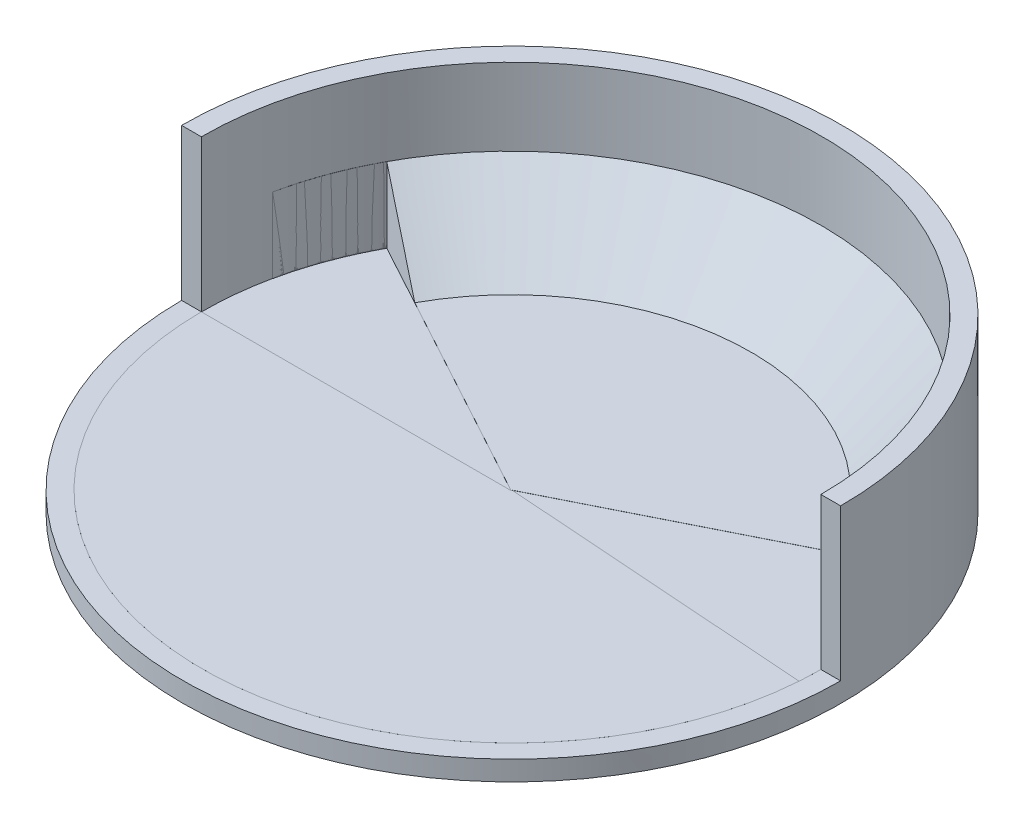
ISO-10303-21;
HEADER;
FILE_DESCRIPTION(('STEP AP214'),'2;1');
FILE_NAME('part.step','',(''),(''),'','','');
FILE_SCHEMA(('AUTOMOTIVE_DESIGN { 1 0 10303 214 1 1 1 1 }'));
ENDSEC;
DATA;
#1=APPLICATION_CONTEXT('core data for automotive mechanical design processes');
#2=APPLICATION_PROTOCOL_DEFINITION('international standard','automotive_design',2000,#1);
#3=PRODUCT_CONTEXT('',#1,'mechanical');
#4=PRODUCT('Part','Part','',(#3));
#5=PRODUCT_RELATED_PRODUCT_CATEGORY('part','',(#4));
#6=PRODUCT_DEFINITION_FORMATION('','',#4);
#7=PRODUCT_DEFINITION_CONTEXT('part definition',#1,'design');
#8=PRODUCT_DEFINITION('design','',#6,#7);
#9=PRODUCT_DEFINITION_SHAPE('','',#8);
#10=(LENGTH_UNIT() NAMED_UNIT(*) SI_UNIT(.MILLI.,.METRE.));
#11=(NAMED_UNIT(*) PLANE_ANGLE_UNIT() SI_UNIT($,.RADIAN.));
#12=(NAMED_UNIT(*) SI_UNIT($,.STERADIAN.) SOLID_ANGLE_UNIT());
#13=UNCERTAINTY_MEASURE_WITH_UNIT(LENGTH_MEASURE(1.E-05),#10,'distance_accuracy_value','');
#14=(GEOMETRIC_REPRESENTATION_CONTEXT(3) GLOBAL_UNCERTAINTY_ASSIGNED_CONTEXT((#13)) GLOBAL_UNIT_ASSIGNED_CONTEXT((#10,
#11,#12)) REPRESENTATION_CONTEXT('',''));
#15=CARTESIAN_POINT('',(0.,0.,0.));
#16=DIRECTION('',(0.,0.,1.));
#17=DIRECTION('',(1.,0.,0.));
#18=AXIS2_PLACEMENT_3D('',#15,#16,#17);
#19=CARTESIAN_POINT('',(-23.4999038261825,1.5,0.0712084203185763));
#20=DIRECTION('',(0.,1.,0.));
#21=DIRECTION('',(-1.,0.,0.));
#22=AXIS2_PLACEMENT_3D('',#19,#20,#21);
#23=PLANE('',#22);
#24=DIRECTION('',(0.878753559484383,0.,0.477275792067362));
#25=VECTOR('',#24,1.);
#26=CARTESIAN_POINT('',(-18.1450892599968,1.5,-9.78800178607371));
#27=LINE('',#26,#25);
#28=CARTESIAN_POINT('',(-20.6506141570449,1.50000000000001,-11.148822879629));
#29=VERTEX_POINT('',#28);
#30=CARTESIAN_POINT('',(-15.9988902095269,1.5,-8.62234067359039));
#31=VERTEX_POINT('',#30);
#32=EDGE_CURVE('E98',#29,#31,#27,.T.);
#33=ORIENTED_EDGE('',*,*,#32,.F.);
#34=CARTESIAN_POINT('',(0.,1.5,0.0671069133202412));
#35=DIRECTION('',(0.,1.,0.));
#36=DIRECTION('',(-1.,0.,0.));
#37=AXIS2_PLACEMENT_3D('',#34,#35,#36);
#38=CIRCLE('',#37,23.4998924717436);
#39=CARTESIAN_POINT('',(-22.9848333838979,1.50000000000001,-4.8259882725473));
#40=VERTEX_POINT('',#39);
#41=EDGE_CURVE('E103',#40,#29,#38,.F.);
#42=ORIENTED_EDGE('',*,*,#41,.F.);
#43=DIRECTION('',(0.978082491719274,0.,0.208217769155797));
#44=VECTOR('',#43,1.);
#45=CARTESIAN_POINT('',(-22.4802386811067,1.5,-4.71856831131445));
#46=LINE('',#45,#44);
#47=CARTESIAN_POINT('',(-22.9848448395551,1.5,-4.82599071126938));
#48=VERTEX_POINT('',#47);
#49=EDGE_CURVE('E123',#48,#40,#46,.T.);
#50=ORIENTED_EDGE('',*,*,#49,.F.);
#51=CARTESIAN_POINT('',(0.,1.5,0.0671069133202412));
#52=DIRECTION('',(0.,-1.,0.));
#53=DIRECTION('',(1.,0.,0.));
#54=AXIS2_PLACEMENT_3D('',#51,#52,#53);
#55=CIRCLE('',#54,23.4999041841065);
#56=CARTESIAN_POINT('',(20.9917102742925,1.5,-10.4966801170182));
#57=VERTEX_POINT('',#56);
#58=EDGE_CURVE('E112',#48,#57,#55,.T.);
#59=ORIENTED_EDGE('',*,*,#58,.T.);
#60=DIRECTION('',(-0.894413130287023,0.,0.447241715820616));
#61=VECTOR('',#60,1.);
#62=CARTESIAN_POINT('',(-18.8278166940009,1.5,9.41464828527145));
#63=LINE('',#62,#61);
#64=CARTESIAN_POINT('',(16.2570612315681,1.5,-8.12916952267244));
#65=VERTEX_POINT('',#64);
#66=EDGE_CURVE('E117',#57,#65,#63,.T.);
#67=ORIENTED_EDGE('',*,*,#66,.T.);
#68=CARTESIAN_POINT('',(0.,1.5,0.0671069133202412));
#69=DIRECTION('',(0.,-1.,0.));
#70=DIRECTION('',(1.,0.,0.));
#71=AXIS2_PLACEMENT_3D('',#68,#69,#70);
#72=CIRCLE('',#71,18.2063446990922);
#73=EDGE_CURVE('E116',#31,#65,#72,.T.);
#74=ORIENTED_EDGE('',*,*,#73,.F.);
#75=EDGE_LOOP('',(#33,#42,#50,#59,#67,#74));
#76=FACE_BOUND('',#75,.T.);
#77=ADVANCED_FACE('F46',(#76),#23,.F.);
#78=CARTESIAN_POINT('',(0.,7.18907418889528,0.0671069133202412));
#79=DIRECTION('',(0.,1.,0.));
#80=DIRECTION('',(-1.,0.,0.));
#81=AXIS2_PLACEMENT_3D('',#78,#79,#80);
#82=CONICAL_SURFACE('',#81,23.4999041841065,0.749400982278209);
#83=CARTESIAN_POINT('',(0.,7.189061601429,0.0671069133202412));
#84=DIRECTION('',(0.,1.,0.));
#85=DIRECTION('',(-1.,0.,0.));
#86=AXIS2_PLACEMENT_3D('',#83,#84,#85);
#87=CIRCLE('',#86,23.4998924717436);
#88=CARTESIAN_POINT('',(-22.984833383898,7.18906160142902,-4.82598827254731));
#89=VERTEX_POINT('',#88);
#90=CARTESIAN_POINT('',(-20.6506141570449,7.18906160142901,-11.148822879629));
#91=VERTEX_POINT('',#90);
#92=EDGE_CURVE('E62',#89,#91,#87,.F.);
#93=ORIENTED_EDGE('',*,*,#92,.T.);
#94=DIRECTION('',(0.598607226270921,-0.732097051273404,0.325120433336666));
#95=VECTOR('',#94,1.);
#96=CARTESIAN_POINT('',(0.,-18.0666537789848,0.0671069133202412));
#97=LINE('',#96,#95);
#98=EDGE_CURVE('E12',#91,#31,#97,.T.);
#99=ORIENTED_EDGE('',*,*,#98,.T.);
#100=ORIENTED_EDGE('',*,*,#73,.T.);
#101=CARTESIAN_POINT('',(20.9918767212185,7.18927418889528,-10.4967633470227));
#102=CARTESIAN_POINT('',(20.2027135171331,6.24102802044445,-10.1021507306533));
#103=CARTESIAN_POINT('',(19.4135500870123,5.29278208714443,-9.70753800125739));
#104=CARTESIAN_POINT('',(17.8352227746996,3.396290690846,-8.91831231641224));
#105=CARTESIAN_POINT('',(17.0460588925078,2.44804522784759,-8.52369936096304));
#106=CARTESIAN_POINT('',(16.2568947842805,1.4998,-8.12908629248722));
#107=B_SPLINE_CURVE_WITH_KNOTS('',3,(#101,#102,#103,#104,#105,#106),.UNSPECIFIED.,.F.,.F.,(4,2,
4),(0.,3.88574526712097,7.771490534242),.UNSPECIFIED.);
#108=CARTESIAN_POINT('',(20.9917102742925,7.18907418889528,-10.4966801170182));
#109=VERTEX_POINT('',#108);
#110=EDGE_CURVE('E114',#109,#65,#107,.T.);
#111=ORIENTED_EDGE('',*,*,#110,.F.);
#112=CARTESIAN_POINT('',(0.,7.18907418889528,0.0671069133202412));
#113=DIRECTION('',(0.,-1.,0.));
#114=DIRECTION('',(1.,0.,0.));
#115=AXIS2_PLACEMENT_3D('',#112,#113,#114);
#116=CIRCLE('',#115,23.4999041841065);
#117=CARTESIAN_POINT('',(-22.984844839555,7.18907418889527,-4.82599071126938));
#118=VERTEX_POINT('',#117);
#119=EDGE_CURVE('E121',#118,#109,#116,.T.);
#120=ORIENTED_EDGE('',*,*,#119,.F.);
#121=DIRECTION('',(0.666270128994717,-0.732097051273404,0.141838015800248));
#122=VECTOR('',#121,1.);
#123=CARTESIAN_POINT('',(0.,-18.0666537789848,0.0671069133202412));
#124=LINE('',#123,#122);
#125=EDGE_CURVE('E107',#118,#89,#124,.T.);
#126=ORIENTED_EDGE('',*,*,#125,.T.);
#127=EDGE_LOOP('',(#93,#99,#100,#111,#120,#126));
#128=FACE_BOUND('',#127,.T.);
#129=ADVANCED_FACE('F48',(#128),#82,.F.);
#130=CARTESIAN_POINT('',(-0.0136666016917367,32.51,0.0641975172925174));
#131=DIRECTION('',(-0.208217769155797,0.,0.978082491719274));
#132=DIRECTION('',(0.978082491719274,0.,0.208217769155797));
#133=AXIS2_PLACEMENT_3D('',#130,#131,#132);
#134=PLANE('',#133);
#135=ORIENTED_EDGE('',*,*,#49,.T.);
#136=DIRECTION('',(0.,-1.,0.));
#137=VECTOR('',#136,1.);
#138=CARTESIAN_POINT('',(-22.9848333838979,27.51,-4.8259882725473));
#139=LINE('',#138,#137);
#140=EDGE_CURVE('E55',#40,#89,#139,.F.);
#141=ORIENTED_EDGE('',*,*,#140,.T.);
#142=ORIENTED_EDGE('',*,*,#125,.F.);
#143=DIRECTION('',(0.,-1.,0.));
#144=VECTOR('',#143,1.);
#145=CARTESIAN_POINT('',(-22.9848448395551,0.,-4.82599071126938));
#146=LINE('',#145,#144);
#147=EDGE_CURVE('E118',#48,#118,#146,.F.);
#148=ORIENTED_EDGE('',*,*,#147,.F.);
#149=EDGE_LOOP('',(#135,#141,#142,#148));
#150=FACE_BOUND('',#149,.T.);
#151=ADVANCED_FACE('F138',(#150),#134,.T.);
#152=CARTESIAN_POINT('',(0.,0.,0.0671069133202412));
#153=DIRECTION('',(0.,-1.,0.));
#154=DIRECTION('',(1.,0.,0.));
#155=AXIS2_PLACEMENT_3D('',#152,#153,#154);
#156=CYLINDRICAL_SURFACE('',#155,23.4999041841065);
#157=DIRECTION('',(0.,-1.,0.));
#158=VECTOR('',#157,1.);
#159=CARTESIAN_POINT('',(20.9917102742925,0.,-10.4966801170182));
#160=LINE('',#159,#158);
#161=EDGE_CURVE('E70',#57,#109,#160,.F.);
#162=ORIENTED_EDGE('',*,*,#161,.F.);
#163=ORIENTED_EDGE('',*,*,#58,.F.);
#164=ORIENTED_EDGE('',*,*,#147,.T.);
#165=ORIENTED_EDGE('',*,*,#119,.T.);
#166=EDGE_LOOP('',(#162,#163,#164,#165));
#167=FACE_BOUND('',#166,.T.);
#168=ADVANCED_FACE('F137',(#167),#156,.T.);
#169=CARTESIAN_POINT('',(0.,14.51,0.));
#170=DIRECTION('',(-0.447241715820616,0.,-0.894413130287023));
#171=DIRECTION('',(-0.894413130287023,0.,0.447241715820616));
#172=AXIS2_PLACEMENT_3D('',#169,#170,#171);
#173=PLANE('',#172);
#174=ORIENTED_EDGE('',*,*,#110,.T.);
#175=ORIENTED_EDGE('',*,*,#66,.F.);
#176=ORIENTED_EDGE('',*,*,#161,.T.);
#177=EDGE_LOOP('',(#174,#175,#176));
#178=FACE_BOUND('',#177,.T.);
#179=ADVANCED_FACE('F132',(#178),#173,.F.);
#180=CARTESIAN_POINT('',(-0.0281451629565942,27.51,0.051820483128305));
#181=DIRECTION('',(-0.477275792067362,0.,0.878753559484383));
#182=DIRECTION('',(0.878753559484383,0.,0.477275792067362));
#183=AXIS2_PLACEMENT_3D('',#180,#181,#182);
#184=PLANE('',#183);
#185=ORIENTED_EDGE('',*,*,#32,.T.);
#186=ORIENTED_EDGE('',*,*,#98,.F.);
#187=DIRECTION('',(0.,-1.,0.));
#188=VECTOR('',#187,1.);
#189=CARTESIAN_POINT('',(-20.6506141570449,27.51,-11.148822879629));
#190=LINE('',#189,#188);
#191=EDGE_CURVE('E96',#91,#29,#190,.T.);
#192=ORIENTED_EDGE('',*,*,#191,.T.);
#193=EDGE_LOOP('',(#185,#186,#192));
#194=FACE_BOUND('',#193,.T.);
#195=ADVANCED_FACE('F95',(#194),#184,.T.);
#196=CARTESIAN_POINT('',(0.,27.51,0.0671069133202412));
#197=DIRECTION('',(0.,-1.,0.));
#198=DIRECTION('',(0.,0.,-1.));
#199=AXIS2_PLACEMENT_3D('',#196,#197,#198);
#200=CYLINDRICAL_SURFACE('',#199,23.4998924717436);
#201=ORIENTED_EDGE('',*,*,#41,.T.);
#202=ORIENTED_EDGE('',*,*,#191,.F.);
#203=ORIENTED_EDGE('',*,*,#92,.F.);
#204=ORIENTED_EDGE('',*,*,#140,.F.);
#205=EDGE_LOOP('',(#201,#202,#203,#204));
#206=FACE_BOUND('',#205,.T.);
#207=ADVANCED_FACE('F101',(#206),#200,.F.);
#208=CLOSED_SHELL('',(#77,#129,#151,#168,#179,#195,#207));
#209=MANIFOLD_SOLID_BREP('B2',#208);
#210=CARTESIAN_POINT('',(0.,0.,0.0671069133202412));
#211=DIRECTION('',(-0.000174532924319865,0.,0.999999984769129));
#212=DIRECTION('',(0.999999984769129,0.,0.000174532924319865));
#213=AXIS2_PLACEMENT_3D('',#210,#211,#212);
#214=PLANE('',#213);
#215=DIRECTION('',(-0.681200332781412,-0.732097051273404,-0.000118891887938832));
#216=VECTOR('',#215,1.);
#217=CARTESIAN_POINT('',(23.4999038261825,7.18907418889528,0.0712084203187299));
#218=LINE('',#217,#216);
#219=CARTESIAN_POINT('',(23.4999038261825,7.18907418889528,0.0712084203187299));
#220=VERTEX_POINT('',#219);
#221=CARTESIAN_POINT('',(23.4998921138197,7.189061601429,0.071208418274537));
#222=VERTEX_POINT('',#221);
#223=EDGE_CURVE('E219',#220,#222,#218,.T.);
#224=ORIENTED_EDGE('',*,*,#223,.T.);
#225=DIRECTION('',(0.,-1.,0.));
#226=VECTOR('',#225,1.);
#227=CARTESIAN_POINT('',(23.4998921138197,14.51,0.071208418274537));
#228=LINE('',#227,#226);
#229=CARTESIAN_POINT('',(23.4998921138197,1.5,0.071208418274537));
#230=VERTEX_POINT('',#229);
#231=EDGE_CURVE('E44',#222,#230,#228,.T.);
#232=ORIENTED_EDGE('',*,*,#231,.T.);
#233=DIRECTION('',(-0.999999984769129,0.,-0.000174532924319865));
#234=VECTOR('',#233,1.);
#235=CARTESIAN_POINT('',(23.4999038261825,1.5,0.0712084203187299));
#236=LINE('',#235,#234);
#237=CARTESIAN_POINT('',(23.4999038261825,1.5,0.0712084203187299));
#238=VERTEX_POINT('',#237);
#239=EDGE_CURVE('E260',#238,#230,#236,.T.);
#240=ORIENTED_EDGE('',*,*,#239,.F.);
#241=DIRECTION('',(0.,1.,0.));
#242=VECTOR('',#241,1.);
#243=CARTESIAN_POINT('',(23.4999038261825,1.5,0.0712084203187299));
#244=LINE('',#243,#242);
#245=EDGE_CURVE('E258',#238,#220,#244,.T.);
#246=ORIENTED_EDGE('',*,*,#245,.T.);
#247=EDGE_LOOP('',(#224,#232,#240,#246));
#248=FACE_BOUND('',#247,.T.);
#249=ADVANCED_FACE('F211',(#248),#214,.T.);
#250=CARTESIAN_POINT('',(0.,0.,0.0671069133202412));
#251=DIRECTION('',(0.,-1.,0.));
#252=DIRECTION('',(1.,0.,0.));
#253=AXIS2_PLACEMENT_3D('',#250,#251,#252);
#254=CYLINDRICAL_SURFACE('',#253,23.4999041841065);
#255=CARTESIAN_POINT('',(0.,1.5,0.0671069133202412));
#256=DIRECTION('',(0.,-1.,0.));
#257=DIRECTION('',(1.,0.,0.));
#258=AXIS2_PLACEMENT_3D('',#255,#256,#257);
#259=CIRCLE('',#258,23.4999041841065);
#260=CARTESIAN_POINT('',(23.4999041841065,1.5,0.067106913319806));
#261=VERTEX_POINT('',#260);
#262=EDGE_CURVE('E233',#261,#238,#259,.T.);
#263=ORIENTED_EDGE('',*,*,#262,.F.);
#264=DIRECTION('',(0.,-1.,0.));
#265=VECTOR('',#264,1.);
#266=CARTESIAN_POINT('',(23.4999041841065,8.,0.0671069133198076));
#267=LINE('',#266,#265);
#268=CARTESIAN_POINT('',(23.4999041841065,7.18907418889528,0.0671069133198074));
#269=VERTEX_POINT('',#268);
#270=EDGE_CURVE('E255',#261,#269,#267,.F.);
#271=ORIENTED_EDGE('',*,*,#270,.T.);
#272=CARTESIAN_POINT('',(0.,7.18907418889528,0.0671069133202412));
#273=DIRECTION('',(0.,-1.,0.));
#274=DIRECTION('',(1.,0.,0.));
#275=AXIS2_PLACEMENT_3D('',#272,#273,#274);
#276=CIRCLE('',#275,23.4999041841065);
#277=EDGE_CURVE('E254',#269,#220,#276,.T.);
#278=ORIENTED_EDGE('',*,*,#277,.T.);
#279=ORIENTED_EDGE('',*,*,#245,.F.);
#280=EDGE_LOOP('',(#263,#271,#278,#279));
#281=FACE_BOUND('',#280,.T.);
#282=ADVANCED_FACE('F213',(#281),#254,.T.);
#283=CARTESIAN_POINT('',(-23.4999038261825,1.5,0.0712084203185763));
#284=DIRECTION('',(0.,1.,0.));
#285=DIRECTION('',(-1.,0.,0.));
#286=AXIS2_PLACEMENT_3D('',#283,#284,#285);
#287=PLANE('',#286);
#288=CARTESIAN_POINT('',(0.,1.5,0.));
#289=DIRECTION('',(0.,1.,0.));
#290=DIRECTION('',(-1.,0.,0.));
#291=AXIS2_PLACEMENT_3D('',#288,#289,#290);
#292=CIRCLE('',#291,23.5);
#293=EDGE_CURVE('E226',#261,#230,#292,.F.);
#294=ORIENTED_EDGE('',*,*,#293,.F.);
#295=ORIENTED_EDGE('',*,*,#262,.T.);
#296=ORIENTED_EDGE('',*,*,#239,.T.);
#297=EDGE_LOOP('',(#294,#295,#296));
#298=FACE_BOUND('',#297,.T.);
#299=ADVANCED_FACE('F265',(#298),#287,.F.);
#300=CARTESIAN_POINT('',(0.,7.18907418889528,0.0671069133202412));
#301=DIRECTION('',(0.,1.,0.));
#302=DIRECTION('',(-1.,0.,0.));
#303=AXIS2_PLACEMENT_3D('',#300,#301,#302);
#304=CONICAL_SURFACE('',#303,23.4999041841065,0.749400982278209);
#305=ORIENTED_EDGE('',*,*,#277,.F.);
#306=CARTESIAN_POINT('',(22.4578007167464,7.21051081967871,-6.92077936123565));
#307=CARTESIAN_POINT('',(22.5458684397292,7.20963451140363,-6.6350002844082));
#308=CARTESIAN_POINT('',(22.6284721816462,7.20875309138728,-6.34756907619321));
#309=CARTESIAN_POINT('',(22.7826525587824,7.20698113255031,-5.76976354321328));
#310=CARTESIAN_POINT('',(22.8542291686002,7.20609059370869,-5.47938921167042));
#311=CARTESIAN_POINT('',(23.0522382704685,7.2034073786324,-4.60453106232709));
#312=CARTESIAN_POINT('',(23.1619911372631,7.20160269473904,-4.01617867211953));
#313=CARTESIAN_POINT('',(23.3343524241693,7.19801311405225,-2.84605182217286));
#314=CARTESIAN_POINT('',(23.397955208201,7.19622867004704,-2.26442215155591));
#315=CARTESIAN_POINT('',(23.4816125224792,7.1926498090637,-1.09803667897976));
#316=CARTESIAN_POINT('',(23.5016681851301,7.19085539234612,-0.513280958707141));
#317=CARTESIAN_POINT('',(23.4981148287309,7.18726658290404,0.65609779937265));
#318=CARTESIAN_POINT('',(23.4745058096787,7.18547219017955,1.24072083717981));
#319=CARTESIAN_POINT('',(23.3837615841124,7.18189343143143,2.40657636135726));
#320=CARTESIAN_POINT('',(23.3166252457115,7.18010906566976,2.98780875916054));
#321=CARTESIAN_POINT('',(23.1371559480599,7.17651971689018,4.15686651273091));
#322=CARTESIAN_POINT('',(23.0238295231747,7.17471518833577,4.74454103902215));
#323=CARTESIAN_POINT('',(22.8205073158856,7.17203228794502,5.6181796758091));
#324=CARTESIAN_POINT('',(22.7471673403647,7.17114186762998,5.90811365399163));
#325=CARTESIAN_POINT('',(22.5894783216427,7.16937017857012,6.48497151951041));
#326=CARTESIAN_POINT('',(22.5051293038012,7.16848890980423,6.77189541377882));
#327=CARTESIAN_POINT('',(22.4153264462346,7.16761277188866,7.05713400104729));
#328=B_SPLINE_CURVE_WITH_KNOTS('',3,(#306,#307,#308,#309,#310,#311,#312,#313,#314,#315,#316,
#317,#318,#319,#320,#321,#322,#323,#324,#325,#326,#327),.UNSPECIFIED.,.F.,.F.,(4,2,2,2,2,2,2,2,
2,2,4),(0.,0.897012331028296,1.7940267283192,3.58763780583959,5.34135230458416,7.09502119898442,
8.8486900934688,10.6024045922921,12.3960156698908,13.2930300672353,14.1900423983208),.UNSPECIFIED.);
#329=EDGE_CURVE('E245',#269,#222,#328,.T.);
#330=ORIENTED_EDGE('',*,*,#329,.T.);
#331=ORIENTED_EDGE('',*,*,#223,.F.);
#332=EDGE_LOOP('',(#305,#330,#331));
#333=FACE_BOUND('',#332,.T.);
#334=ADVANCED_FACE('F253',(#333),#304,.F.);
#335=CARTESIAN_POINT('',(0.,14.51,0.));
#336=DIRECTION('',(0.,-1.,0.));
#337=DIRECTION('',(0.,0.,-1.));
#338=AXIS2_PLACEMENT_3D('',#335,#336,#337);
#339=CYLINDRICAL_SURFACE('',#338,23.5);
#340=ORIENTED_EDGE('',*,*,#293,.T.);
#341=ORIENTED_EDGE('',*,*,#231,.F.);
#342=ORIENTED_EDGE('',*,*,#329,.F.);
#343=ORIENTED_EDGE('',*,*,#270,.F.);
#344=EDGE_LOOP('',(#340,#341,#342,#343));
#345=FACE_BOUND('',#344,.T.);
#346=ADVANCED_FACE('F244',(#345),#339,.F.);
#347=CLOSED_SHELL('',(#249,#282,#299,#334,#346));
#348=MANIFOLD_SOLID_BREP('B6',#347);
#349=CARTESIAN_POINT('',(0.,0.,0.0671069133202412));
#350=DIRECTION('',(-0.000174532924313326,0.,-0.999999984769129));
#351=DIRECTION('',(-0.999999984769129,0.,0.000174532924313326));
#352=AXIS2_PLACEMENT_3D('',#349,#350,#351);
#353=PLANE('',#352);
#354=DIRECTION('',(0.,-1.,0.));
#355=VECTOR('',#354,1.);
#356=CARTESIAN_POINT('',(-23.4998921138197,32.51,0.0712084182743833));
#357=LINE('',#356,#355);
#358=CARTESIAN_POINT('',(-23.4998921138197,7.189061601429,0.0712084182743833));
#359=VERTEX_POINT('',#358);
#360=CARTESIAN_POINT('',(-23.4998921138197,1.5,0.0712084182743833));
#361=VERTEX_POINT('',#360);
#362=EDGE_CURVE('E209',#359,#361,#357,.T.);
#363=ORIENTED_EDGE('',*,*,#362,.F.);
#364=DIRECTION('',(0.681200332781412,-0.732097051273404,-0.000118891887934378));
#365=VECTOR('',#364,1.);
#366=CARTESIAN_POINT('',(-23.4999038261825,7.18907418889528,0.0712084203185763));
#367=LINE('',#366,#365);
#368=CARTESIAN_POINT('',(-23.4999038261825,7.18907418889528,0.0712084203185763));
#369=VERTEX_POINT('',#368);
#370=EDGE_CURVE('E374',#369,#359,#367,.T.);
#371=ORIENTED_EDGE('',*,*,#370,.F.);
#372=DIRECTION('',(0.,1.,0.));
#373=VECTOR('',#372,1.);
#374=CARTESIAN_POINT('',(-23.4999038261825,1.5,0.0712084203185763));
#375=LINE('',#374,#373);
#376=CARTESIAN_POINT('',(-23.4999038261825,1.5,0.0712084203185763));
#377=VERTEX_POINT('',#376);
#378=EDGE_CURVE('E373',#377,#369,#375,.T.);
#379=ORIENTED_EDGE('',*,*,#378,.F.);
#380=DIRECTION('',(0.999999984769129,0.,-0.000174532924313326));
#381=VECTOR('',#380,1.);
#382=CARTESIAN_POINT('',(-23.4999038261825,1.5,0.0712084203185763));
#383=LINE('',#382,#381);
#384=EDGE_CURVE('E370',#377,#361,#383,.T.);
#385=ORIENTED_EDGE('',*,*,#384,.T.);
#386=EDGE_LOOP('',(#363,#371,#379,#385));
#387=FACE_BOUND('',#386,.T.);
#388=ADVANCED_FACE('F326',(#387),#353,.F.);
#389=CARTESIAN_POINT('',(-23.4999038261825,1.5,0.0712084203185763));
#390=DIRECTION('',(0.,1.,0.));
#391=DIRECTION('',(-1.,0.,0.));
#392=AXIS2_PLACEMENT_3D('',#389,#390,#391);
#393=PLANE('',#392);
#394=CARTESIAN_POINT('',(0.,1.5,0.));
#395=DIRECTION('',(0.,1.,0.));
#396=DIRECTION('',(-1.,0.,0.));
#397=AXIS2_PLACEMENT_3D('',#394,#395,#396);
#398=CIRCLE('',#397,23.5);
#399=CARTESIAN_POINT('',(-23.4999041841065,1.5,0.0671069133198052));
#400=VERTEX_POINT('',#399);
#401=EDGE_CURVE('E362',#361,#400,#398,.F.);
#402=ORIENTED_EDGE('',*,*,#401,.F.);
#403=ORIENTED_EDGE('',*,*,#384,.F.);
#404=CARTESIAN_POINT('',(0.,1.5,0.0671069133202412));
#405=DIRECTION('',(0.,-1.,0.));
#406=DIRECTION('',(1.,0.,0.));
#407=AXIS2_PLACEMENT_3D('',#404,#405,#406);
#408=CIRCLE('',#407,23.4999041841065);
#409=EDGE_CURVE('E349',#377,#400,#408,.T.);
#410=ORIENTED_EDGE('',*,*,#409,.T.);
#411=EDGE_LOOP('',(#402,#403,#410));
#412=FACE_BOUND('',#411,.T.);
#413=ADVANCED_FACE('F369',(#412),#393,.F.);
#414=CARTESIAN_POINT('',(0.,7.18907418889528,0.0671069133202412));
#415=DIRECTION('',(0.,1.,0.));
#416=DIRECTION('',(-1.,0.,0.));
#417=AXIS2_PLACEMENT_3D('',#414,#415,#416);
#418=CONICAL_SURFACE('',#417,23.4999041841065,0.749400982278209);
#419=ORIENTED_EDGE('',*,*,#370,.T.);
#420=CARTESIAN_POINT('',(-23.2461740235106,7.17870652508064,3.44461801491274));
#421=CARTESIAN_POINT('',(-23.2875660048715,7.17956419733754,3.16526841094402));
#422=CARTESIAN_POINT('',(-23.323918958471,7.18042397873071,2.88521758946755));
#423=CARTESIAN_POINT('',(-23.3865149604174,7.18214705155668,2.32394387147732));
#424=CARTESIAN_POINT('',(-23.4127564202022,7.18301034351951,2.04272079780673));
#425=CARTESIAN_POINT('',(-23.4761626505671,7.18560050491537,1.19891509738462));
#426=CARTESIAN_POINT('',(-23.4981776784892,7.18733115164444,0.6350586945628));
#427=CARTESIAN_POINT('',(-23.499961916812,7.18913205515056,0.0482517565382171));
#428=CARTESIAN_POINT('',(-23.4999980614177,7.18920312130131,0.0250954427116041));
#429=CARTESIAN_POINT('',(-23.5000562608557,7.19142847339734,-0.700020091315089));
#430=CARTESIAN_POINT('',(-23.4686076026368,7.19358408405179,-1.40250101882371));
#431=CARTESIAN_POINT('',(-23.3743792372781,7.1968040790267,-2.45198212345832));
#432=CARTESIAN_POINT('',(-23.3350806325278,7.19787596279887,-2.8013596492706));
#433=CARTESIAN_POINT('',(-23.2408503275213,7.20001328343821,-3.4980574029053));
#434=CARTESIAN_POINT('',(-23.1859172545101,7.20107871973089,-3.84537744733966));
#435=CARTESIAN_POINT('',(-23.0093488941437,7.20406663870247,-4.81946608479084));
#436=CARTESIAN_POINT('',(-22.8698551757286,7.20597931084976,-5.44308650186013));
#437=CARTESIAN_POINT('',(-22.5405141669642,7.20976359368856,-6.67707671354056));
#438=CARTESIAN_POINT('',(-22.3506457529532,7.21163518679707,-7.28744083294721));
#439=CARTESIAN_POINT('',(-21.9213462714817,7.21532839069119,-8.49199905438257));
#440=CARTESIAN_POINT('',(-21.6818143405226,7.21714989107915,-9.08615742062686));
#441=CARTESIAN_POINT('',(-21.2868688481378,7.21983162228396,-9.96100719998872));
#442=CARTESIAN_POINT('',(-21.1492898157139,7.22071705338961,-10.249873116098));
#443=CARTESIAN_POINT('',(-20.8624562165418,7.22246987119584,-10.8217474984037));
#444=CARTESIAN_POINT('',(-20.7132016976083,7.2233372579703,-11.1047559885821));
#445=CARTESIAN_POINT('',(-20.5582137579307,7.22419500101389,-11.3846320574373));
#446=B_SPLINE_CURVE_WITH_KNOTS('',3,(#420,#421,#422,#423,#424,#425,#426,#427,#428,#429,#430,
#431,#432,#433,#434,#435,#436,#437,#438,#439,#440,#441,#442,#443,#444,#445),.UNSPECIFIED.,.F.,
.F.,(4,2,2,2,2,2,2,2,2,2,2,2,4),(0.,0.847066761153676,1.69426654618492,3.38522429525503,
3.45469456476897,5.56055908918154,6.61505462114684,7.66964276967082,9.58445567316823,
11.5000727892441,13.4196191971643,14.3792598739766,15.3388966209823),.UNSPECIFIED.);
#447=CARTESIAN_POINT('',(-23.4999041841065,7.18907418889528,0.0671069133198058));
#448=VERTEX_POINT('',#447);
#449=EDGE_CURVE('E341',#359,#448,#446,.T.);
#450=ORIENTED_EDGE('',*,*,#449,.T.);
#451=CARTESIAN_POINT('',(0.,7.18907418889528,0.0671069133202412));
#452=DIRECTION('',(0.,-1.,0.));
#453=DIRECTION('',(1.,0.,0.));
#454=AXIS2_PLACEMENT_3D('',#451,#452,#453);
#455=CIRCLE('',#454,23.4999041841065);
#456=EDGE_CURVE('E335',#369,#448,#455,.T.);
#457=ORIENTED_EDGE('',*,*,#456,.F.);
#458=EDGE_LOOP('',(#419,#450,#457));
#459=FACE_BOUND('',#458,.T.);
#460=ADVANCED_FACE('F328',(#459),#418,.F.);
#461=CARTESIAN_POINT('',(0.,0.,0.0671069133202412));
#462=DIRECTION('',(0.,-1.,0.));
#463=DIRECTION('',(1.,0.,0.));
#464=AXIS2_PLACEMENT_3D('',#461,#462,#463);
#465=CYLINDRICAL_SURFACE('',#464,23.4999041841065);
#466=ORIENTED_EDGE('',*,*,#456,.T.);
#467=DIRECTION('',(0.,-1.,0.));
#468=VECTOR('',#467,1.);
#469=CARTESIAN_POINT('',(-23.4999041841065,17.,0.0671069133198014));
#470=LINE('',#469,#468);
#471=EDGE_CURVE('E371',#448,#400,#470,.T.);
#472=ORIENTED_EDGE('',*,*,#471,.T.);
#473=ORIENTED_EDGE('',*,*,#409,.F.);
#474=ORIENTED_EDGE('',*,*,#378,.T.);
#475=EDGE_LOOP('',(#466,#472,#473,#474));
#476=FACE_BOUND('',#475,.T.);
#477=ADVANCED_FACE('F380',(#476),#465,.T.);
#478=CARTESIAN_POINT('',(0.,32.51,0.));
#479=DIRECTION('',(0.,-1.,0.));
#480=DIRECTION('',(0.,0.,-1.));
#481=AXIS2_PLACEMENT_3D('',#478,#479,#480);
#482=CYLINDRICAL_SURFACE('',#481,23.5);
#483=ORIENTED_EDGE('',*,*,#362,.T.);
#484=ORIENTED_EDGE('',*,*,#401,.T.);
#485=ORIENTED_EDGE('',*,*,#471,.F.);
#486=ORIENTED_EDGE('',*,*,#449,.F.);
#487=EDGE_LOOP('',(#483,#484,#485,#486));
#488=FACE_BOUND('',#487,.T.);
#489=ADVANCED_FACE('F361',(#488),#482,.F.);
#490=CLOSED_SHELL('',(#388,#413,#460,#477,#489));
#491=MANIFOLD_SOLID_BREP('B38',#490);
#492=CARTESIAN_POINT('',(0.,1.5,0.));
#493=DIRECTION('',(0.,1.,0.));
#494=DIRECTION('',(0.,0.,1.));
#495=AXIS2_PLACEMENT_3D('',#492,#493,#494);
#496=PLANE('',#495);
#497=CARTESIAN_POINT('',(0.,1.5,0.0671069133202412));
#498=DIRECTION('',(0.,1.,0.));
#499=DIRECTION('',(0.,0.,1.));
#500=AXIS2_PLACEMENT_3D('',#497,#498,#499);
#501=CIRCLE('',#500,23.4998924717436);
#502=CARTESIAN_POINT('',(-22.9848333838979,1.50000000000001,-4.8259882725473));
#503=VERTEX_POINT('',#502);
#504=CARTESIAN_POINT('',(-20.6506141570449,1.50000000000001,-11.148822879629));
#505=VERTEX_POINT('',#504);
#506=EDGE_CURVE('E538',#503,#505,#501,.F.);
#507=ORIENTED_EDGE('',*,*,#506,.T.);
#508=DIRECTION('',(0.878753559484383,0.,0.477275792067362));
#509=VECTOR('',#508,1.);
#510=CARTESIAN_POINT('',(-0.0281451629565942,1.5,0.051820483128305));
#511=LINE('',#510,#509);
#512=CARTESIAN_POINT('',(0.,1.50000000000001,0.0671069133202412));
#513=VERTEX_POINT('',#512);
#514=EDGE_CURVE('E535',#505,#513,#511,.T.);
#515=ORIENTED_EDGE('',*,*,#514,.T.);
#516=DIRECTION('',(0.999999984769129,0.,-0.000174532924313326));
#517=VECTOR('',#516,1.);
#518=CARTESIAN_POINT('',(1.17123656450331E-05,1.5,0.0671069112760477));
#519=LINE('',#518,#517);
#520=CARTESIAN_POINT('',(-23.4998921138197,1.5,0.0712084182743833));
#521=VERTEX_POINT('',#520);
#522=EDGE_CURVE('E588',#521,#513,#519,.T.);
#523=ORIENTED_EDGE('',*,*,#522,.F.);
#524=CARTESIAN_POINT('',(0.,1.5,0.));
#525=DIRECTION('',(0.,1.,0.));
#526=DIRECTION('',(0.,0.,1.));
#527=AXIS2_PLACEMENT_3D('',#524,#525,#526);
#528=CIRCLE('',#527,23.5);
#529=CARTESIAN_POINT('',(23.4408811441613,1.5,1.66586049394972));
#530=VERTEX_POINT('',#529);
#531=EDGE_CURVE('E624',#530,#521,#528,.F.);
#532=ORIENTED_EDGE('',*,*,#531,.F.);
#533=DIRECTION('',(-0.997484304006865,0.,-0.0708876805936049));
#534=VECTOR('',#533,1.);
#535=CARTESIAN_POINT('',(0.,1.5,0.));
#536=LINE('',#535,#534);
#537=CARTESIAN_POINT('',(0.,1.5,0.));
#538=VERTEX_POINT('',#537);
#539=EDGE_CURVE('E570',#530,#538,#536,.T.);
#540=ORIENTED_EDGE('',*,*,#539,.T.);
#541=DIRECTION('',(-0.894413130287023,0.,0.447241715820616));
#542=VECTOR('',#541,1.);
#543=CARTESIAN_POINT('',(0.,1.5,0.));
#544=LINE('',#543,#542);
#545=CARTESIAN_POINT('',(21.018708561745,1.5,-10.5101803217845));
#546=VERTEX_POINT('',#545);
#547=EDGE_CURVE('E573',#546,#538,#544,.T.);
#548=ORIENTED_EDGE('',*,*,#547,.F.);
#549=CARTESIAN_POINT('',(-22.9985155042715,1.5,-4.82890097224863));
#550=VERTEX_POINT('',#549);
#551=EDGE_CURVE('E443',#550,#546,#528,.F.);
#552=ORIENTED_EDGE('',*,*,#551,.F.);
#553=DIRECTION('',(0.978082491719274,0.,0.208217769155797));
#554=VECTOR('',#553,1.);
#555=CARTESIAN_POINT('',(-0.0136666016917367,1.5,0.0641975172925174));
#556=LINE('',#555,#554);
#557=EDGE_CURVE('E324',#550,#503,#556,.T.);
#558=ORIENTED_EDGE('',*,*,#557,.T.);
#559=EDGE_LOOP('',(#507,#515,#523,#532,#540,#548,#552,#558));
#560=FACE_BOUND('',#559,.T.);
#561=ADVANCED_FACE('F435',(#560),#496,.T.);
#562=CARTESIAN_POINT('',(-0.0136666016917367,32.51,0.0641975172925174));
#563=DIRECTION('',(-0.208217769155797,0.,0.978082491719274));
#564=DIRECTION('',(0.978082491719274,0.,0.208217769155797));
#565=AXIS2_PLACEMENT_3D('',#562,#563,#564);
#566=PLANE('',#565);
#567=DIRECTION('',(-0.978082491719274,0.,-0.208217769155797));
#568=VECTOR('',#567,1.);
#569=CARTESIAN_POINT('',(-0.0136666016917367,1.49,0.0641975172925174));
#570=LINE('',#569,#568);
#571=CARTESIAN_POINT('',(-22.984833383898,1.49,-4.82598827254731));
#572=VERTEX_POINT('',#571);
#573=CARTESIAN_POINT('',(-22.9985155042715,1.49,-4.82890097224863));
#574=VERTEX_POINT('',#573);
#575=EDGE_CURVE('E576',#572,#574,#570,.T.);
#576=ORIENTED_EDGE('',*,*,#575,.F.);
#577=DIRECTION('',(0.,-1.,0.));
#578=VECTOR('',#577,1.);
#579=CARTESIAN_POINT('',(-22.9848333838979,27.51,-4.8259882725473));
#580=LINE('',#579,#578);
#581=EDGE_CURVE('E539',#503,#572,#580,.T.);
#582=ORIENTED_EDGE('',*,*,#581,.F.);
#583=ORIENTED_EDGE('',*,*,#557,.F.);
#584=DIRECTION('',(0.,-1.,0.));
#585=VECTOR('',#584,1.);
#586=CARTESIAN_POINT('',(-22.9985155042715,32.51,-4.82890097224863));
#587=LINE('',#586,#585);
#588=EDGE_CURVE('E583',#550,#574,#587,.T.);
#589=ORIENTED_EDGE('',*,*,#588,.T.);
#590=EDGE_LOOP('',(#576,#582,#583,#589));
#591=FACE_BOUND('',#590,.T.);
#592=ADVANCED_FACE('F642',(#591),#566,.T.);
#593=CARTESIAN_POINT('',(0.,16.5,0.));
#594=DIRECTION('',(0.,-1.,0.));
#595=DIRECTION('',(0.,0.,-1.));
#596=AXIS2_PLACEMENT_3D('',#593,#594,#595);
#597=CYLINDRICAL_SURFACE('',#596,23.5);
#598=DIRECTION('',(0.,-1.,0.));
#599=VECTOR('',#598,1.);
#600=CARTESIAN_POINT('',(23.4408811441613,14.51,1.66586049394972));
#601=LINE('',#600,#599);
#602=CARTESIAN_POINT('',(23.4408811441613,1.499,1.66586049394972));
#603=VERTEX_POINT('',#602);
#604=EDGE_CURVE('E458',#530,#603,#601,.T.);
#605=ORIENTED_EDGE('',*,*,#604,.F.);
#606=ORIENTED_EDGE('',*,*,#531,.T.);
#607=DIRECTION('',(0.,-1.,0.));
#608=VECTOR('',#607,1.);
#609=CARTESIAN_POINT('',(-23.4998921138197,32.51,0.0712084182743833));
#610=LINE('',#609,#608);
#611=CARTESIAN_POINT('',(-23.4998921138197,1.499,0.0712084182743833));
#612=VERTEX_POINT('',#611);
#613=EDGE_CURVE('E582',#521,#612,#610,.T.);
#614=ORIENTED_EDGE('',*,*,#613,.T.);
#615=CARTESIAN_POINT('',(0.,1.499,0.));
#616=DIRECTION('',(0.,1.,0.));
#617=DIRECTION('',(0.,0.,1.));
#618=AXIS2_PLACEMENT_3D('',#615,#616,#617);
#619=CIRCLE('',#618,23.5);
#620=EDGE_CURVE('E595',#612,#603,#619,.T.);
#621=ORIENTED_EDGE('',*,*,#620,.T.);
#622=EDGE_LOOP('',(#605,#606,#614,#621));
#623=FACE_BOUND('',#622,.T.);
#624=ADVANCED_FACE('F633',(#623),#597,.T.);
#625=CARTESIAN_POINT('',(0.,1.5,0.));
#626=DIRECTION('',(0.,-1.,0.));
#627=DIRECTION('',(0.,0.,-1.));
#628=AXIS2_PLACEMENT_3D('',#625,#626,#627);
#629=CYLINDRICAL_SURFACE('',#628,25.);
#630=CARTESIAN_POINT('',(0.,0.,0.));
#631=DIRECTION('',(0.,1.,0.));
#632=DIRECTION('',(0.,0.,1.));
#633=AXIS2_PLACEMENT_3D('',#630,#631,#632);
#634=CIRCLE('',#633,25.);
#635=CARTESIAN_POINT('',(0.,0.,25.));
#636=VERTEX_POINT('',#635);
#637=EDGE_CURVE('E622',#636,#636,#634,.T.);
#638=ORIENTED_EDGE('',*,*,#637,.T.);
#639=EDGE_LOOP('',(#638));
#640=FACE_BOUND('',#639,.T.);
#641=DIRECTION('',(0.,-1.,0.));
#642=VECTOR('',#641,1.);
#643=CARTESIAN_POINT('',(-24.9999099330815,16.5,0.0671069133202441));
#644=LINE('',#643,#642);
#645=CARTESIAN_POINT('',(-24.9999099330815,13.,0.0671069133202441));
#646=VERTEX_POINT('',#645);
#647=CARTESIAN_POINT('',(-24.9999099330815,1.499,0.0671069133202441));
#648=VERTEX_POINT('',#647);
#649=EDGE_CURVE('E608',#646,#648,#644,.T.);
#650=ORIENTED_EDGE('',*,*,#649,.F.);
#651=CARTESIAN_POINT('',(0.,13.,0.));
#652=DIRECTION('',(0.,1.,0.));
#653=DIRECTION('',(0.,0.,1.));
#654=AXIS2_PLACEMENT_3D('',#651,#652,#653);
#655=CIRCLE('',#654,25.);
#656=CARTESIAN_POINT('',(24.9999099330815,13.,0.0671069133202441));
#657=VERTEX_POINT('',#656);
#658=EDGE_CURVE('E617',#657,#646,#655,.T.);
#659=ORIENTED_EDGE('',*,*,#658,.F.);
#660=DIRECTION('',(0.,-1.,0.));
#661=VECTOR('',#660,1.);
#662=CARTESIAN_POINT('',(24.9999099330815,16.5,0.0671069133202441));
#663=LINE('',#662,#661);
#664=CARTESIAN_POINT('',(24.9999099330815,1.499,0.0671069133202441));
#665=VERTEX_POINT('',#664);
#666=EDGE_CURVE('E605',#657,#665,#663,.T.);
#667=ORIENTED_EDGE('',*,*,#666,.T.);
#668=CARTESIAN_POINT('',(0.,1.499,0.));
#669=DIRECTION('',(0.,1.,0.));
#670=DIRECTION('',(0.,0.,1.));
#671=AXIS2_PLACEMENT_3D('',#668,#669,#670);
#672=CIRCLE('',#671,25.);
#673=EDGE_CURVE('E598',#648,#665,#672,.T.);
#674=ORIENTED_EDGE('',*,*,#673,.F.);
#675=EDGE_LOOP('',(#650,#659,#667,#674));
#676=FACE_BOUND('',#675,.T.);
#677=ADVANCED_FACE('F437',(#640,#676),#629,.T.);
#678=CARTESIAN_POINT('',(0.,13.,0.));
#679=DIRECTION('',(0.,-1.,0.));
#680=DIRECTION('',(0.,0.,-1.));
#681=AXIS2_PLACEMENT_3D('',#678,#679,#680);
#682=CYLINDRICAL_SURFACE('',#681,23.5);
#683=ORIENTED_EDGE('',*,*,#551,.T.);
#684=DIRECTION('',(0.,-1.,0.));
#685=VECTOR('',#684,1.);
#686=CARTESIAN_POINT('',(21.018708561745,14.51,-10.5101803217845));
#687=LINE('',#686,#685);
#688=CARTESIAN_POINT('',(21.018708561745,1.49,-10.5101803217845));
#689=VERTEX_POINT('',#688);
#690=EDGE_CURVE('E564',#546,#689,#687,.T.);
#691=ORIENTED_EDGE('',*,*,#690,.T.);
#692=CARTESIAN_POINT('',(0.,1.49,0.));
#693=DIRECTION('',(0.,1.,0.));
#694=DIRECTION('',(0.,0.,1.));
#695=AXIS2_PLACEMENT_3D('',#692,#693,#694);
#696=CIRCLE('',#695,23.5);
#697=CARTESIAN_POINT('',(23.4408811441613,1.49,1.66586049394972));
#698=VERTEX_POINT('',#697);
#699=EDGE_CURVE('E561',#698,#689,#696,.T.);
#700=ORIENTED_EDGE('',*,*,#699,.F.);
#701=EDGE_CURVE('E566',#603,#698,#601,.T.);
#702=ORIENTED_EDGE('',*,*,#701,.F.);
#703=CARTESIAN_POINT('',(23.4999041841065,1.499,0.067106913320244));
#704=VERTEX_POINT('',#703);
#705=EDGE_CURVE('E591',#603,#704,#619,.T.);
#706=ORIENTED_EDGE('',*,*,#705,.T.);
#707=DIRECTION('',(0.,-1.,0.));
#708=VECTOR('',#707,1.);
#709=CARTESIAN_POINT('',(23.4999041841065,16.5,0.067106913320244));
#710=LINE('',#709,#708);
#711=CARTESIAN_POINT('',(23.4999041841065,13.,0.067106913320244));
#712=VERTEX_POINT('',#711);
#713=EDGE_CURVE('E603',#712,#704,#710,.T.);
#714=ORIENTED_EDGE('',*,*,#713,.F.);
#715=CARTESIAN_POINT('',(0.,13.,0.));
#716=DIRECTION('',(0.,1.,0.));
#717=DIRECTION('',(0.,0.,1.));
#718=AXIS2_PLACEMENT_3D('',#715,#716,#717);
#719=CIRCLE('',#718,23.5);
#720=CARTESIAN_POINT('',(-23.4999041841065,13.,0.067106913320244));
#721=VERTEX_POINT('',#720);
#722=EDGE_CURVE('E620',#712,#721,#719,.T.);
#723=ORIENTED_EDGE('',*,*,#722,.T.);
#724=DIRECTION('',(0.,-1.,0.));
#725=VECTOR('',#724,1.);
#726=CARTESIAN_POINT('',(-23.4999041841065,16.5,0.067106913320244));
#727=LINE('',#726,#725);
#728=CARTESIAN_POINT('',(-23.4999041841065,1.499,0.067106913320244));
#729=VERTEX_POINT('',#728);
#730=EDGE_CURVE('E610',#721,#729,#727,.T.);
#731=ORIENTED_EDGE('',*,*,#730,.T.);
#732=EDGE_CURVE('E592',#729,#612,#619,.T.);
#733=ORIENTED_EDGE('',*,*,#732,.T.);
#734=CARTESIAN_POINT('',(-23.4998921138197,1.49,0.0712084182743833));
#735=VERTEX_POINT('',#734);
#736=EDGE_CURVE('E580',#612,#735,#610,.T.);
#737=ORIENTED_EDGE('',*,*,#736,.T.);
#738=CARTESIAN_POINT('',(0.,1.49,0.));
#739=DIRECTION('',(0.,1.,0.));
#740=DIRECTION('',(0.,0.,1.));
#741=AXIS2_PLACEMENT_3D('',#738,#739,#740);
#742=CIRCLE('',#741,23.5);
#743=EDGE_CURVE('E578',#574,#735,#742,.T.);
#744=ORIENTED_EDGE('',*,*,#743,.F.);
#745=ORIENTED_EDGE('',*,*,#588,.F.);
#746=EDGE_LOOP('',(#683,#691,#700,#702,#706,#714,#723,#731,#733,#737,#744,#745));
#747=FACE_BOUND('',#746,.T.);
#748=ADVANCED_FACE('F644',(#747),#682,.F.);
#749=CARTESIAN_POINT('',(0.,13.,0.));
#750=DIRECTION('',(0.,1.,0.));
#751=DIRECTION('',(0.,0.,1.));
#752=AXIS2_PLACEMENT_3D('',#749,#750,#751);
#753=PLANE('',#752);
#754=ORIENTED_EDGE('',*,*,#658,.T.);
#755=DIRECTION('',(1.,0.,0.));
#756=VECTOR('',#755,1.);
#757=CARTESIAN_POINT('',(0.,13.,0.0671069133202412));
#758=LINE('',#757,#756);
#759=EDGE_CURVE('E614',#646,#721,#758,.T.);
#760=ORIENTED_EDGE('',*,*,#759,.T.);
#761=ORIENTED_EDGE('',*,*,#722,.F.);
#762=DIRECTION('',(-1.,0.,0.));
#763=VECTOR('',#762,1.);
#764=CARTESIAN_POINT('',(0.,13.,0.0671069133202412));
#765=LINE('',#764,#763);
#766=EDGE_CURVE('E612',#657,#712,#765,.T.);
#767=ORIENTED_EDGE('',*,*,#766,.F.);
#768=EDGE_LOOP('',(#754,#760,#761,#767));
#769=FACE_BOUND('',#768,.T.);
#770=ADVANCED_FACE('F659',(#769),#753,.T.);
#771=CARTESIAN_POINT('',(0.,0.,0.));
#772=DIRECTION('',(0.,1.,0.));
#773=DIRECTION('',(0.,0.,1.));
#774=AXIS2_PLACEMENT_3D('',#771,#772,#773);
#775=PLANE('',#774);
#776=ORIENTED_EDGE('',*,*,#637,.F.);
#777=EDGE_LOOP('',(#776));
#778=FACE_BOUND('',#777,.T.);
#779=ADVANCED_FACE('F693',(#778),#775,.F.);
#780=CARTESIAN_POINT('',(0.,16.5,0.0671069133202412));
#781=DIRECTION('',(0.,0.,1.));
#782=DIRECTION('',(1.,0.,0.));
#783=AXIS2_PLACEMENT_3D('',#780,#781,#782);
#784=PLANE('',#783);
#785=ORIENTED_EDGE('',*,*,#649,.T.);
#786=DIRECTION('',(-1.,0.,0.));
#787=VECTOR('',#786,1.);
#788=CARTESIAN_POINT('',(0.,1.499,0.0671069133202412));
#789=LINE('',#788,#787);
#790=EDGE_CURVE('E594',#729,#648,#789,.T.);
#791=ORIENTED_EDGE('',*,*,#790,.F.);
#792=ORIENTED_EDGE('',*,*,#730,.F.);
#793=ORIENTED_EDGE('',*,*,#759,.F.);
#794=EDGE_LOOP('',(#785,#791,#792,#793));
#795=FACE_BOUND('',#794,.T.);
#796=ADVANCED_FACE('F653',(#795),#784,.T.);
#797=CARTESIAN_POINT('',(0.,16.5,0.0671069133202412));
#798=DIRECTION('',(0.,0.,-1.));
#799=DIRECTION('',(-1.,0.,0.));
#800=AXIS2_PLACEMENT_3D('',#797,#798,#799);
#801=PLANE('',#800);
#802=ORIENTED_EDGE('',*,*,#766,.T.);
#803=ORIENTED_EDGE('',*,*,#713,.T.);
#804=DIRECTION('',(1.,0.,0.));
#805=VECTOR('',#804,1.);
#806=CARTESIAN_POINT('',(0.,1.499,0.0671069133202412));
#807=LINE('',#806,#805);
#808=EDGE_CURVE('E601',#704,#665,#807,.T.);
#809=ORIENTED_EDGE('',*,*,#808,.T.);
#810=ORIENTED_EDGE('',*,*,#666,.F.);
#811=EDGE_LOOP('',(#802,#803,#809,#810));
#812=FACE_BOUND('',#811,.T.);
#813=ADVANCED_FACE('F663',(#812),#801,.F.);
#814=CARTESIAN_POINT('',(0.,1.499,0.));
#815=DIRECTION('',(0.,1.,0.));
#816=DIRECTION('',(0.,0.,1.));
#817=AXIS2_PLACEMENT_3D('',#814,#815,#816);
#818=PLANE('',#817);
#819=ORIENTED_EDGE('',*,*,#732,.F.);
#820=ORIENTED_EDGE('',*,*,#790,.T.);
#821=ORIENTED_EDGE('',*,*,#673,.T.);
#822=ORIENTED_EDGE('',*,*,#808,.F.);
#823=ORIENTED_EDGE('',*,*,#705,.F.);
#824=ORIENTED_EDGE('',*,*,#620,.F.);
#825=EDGE_LOOP('',(#819,#820,#821,#822,#823,#824));
#826=FACE_BOUND('',#825,.T.);
#827=ADVANCED_FACE('F649',(#826),#818,.T.);
#828=CARTESIAN_POINT('',(1.17123656450331E-05,32.51,0.0671069112760477));
#829=DIRECTION('',(0.000174532924313326,0.,0.999999984769129));
#830=DIRECTION('',(0.999999984769129,0.,-0.000174532924313326));
#831=AXIS2_PLACEMENT_3D('',#828,#829,#830);
#832=PLANE('',#831);
#833=ORIENTED_EDGE('',*,*,#522,.T.);
#834=DIRECTION('',(0.,-1.,0.));
#835=VECTOR('',#834,1.);
#836=CARTESIAN_POINT('',(0.,32.51,0.0671069133202412));
#837=LINE('',#836,#835);
#838=CARTESIAN_POINT('',(0.,1.49,0.0671069133202412));
#839=VERTEX_POINT('',#838);
#840=EDGE_CURVE('E586',#513,#839,#837,.T.);
#841=ORIENTED_EDGE('',*,*,#840,.T.);
#842=DIRECTION('',(-0.999999984769129,0.,0.000174532924313326));
#843=VECTOR('',#842,1.);
#844=CARTESIAN_POINT('',(1.17123656450331E-05,1.49,0.0671069112760477));
#845=LINE('',#844,#843);
#846=EDGE_CURVE('E549',#839,#735,#845,.T.);
#847=ORIENTED_EDGE('',*,*,#846,.T.);
#848=ORIENTED_EDGE('',*,*,#736,.F.);
#849=ORIENTED_EDGE('',*,*,#613,.F.);
#850=EDGE_LOOP('',(#833,#841,#847,#848,#849));
#851=FACE_BOUND('',#850,.T.);
#852=ADVANCED_FACE('F640',(#851),#832,.F.);
#853=CARTESIAN_POINT('',(0.,1.49,0.));
#854=DIRECTION('',(0.,1.,0.));
#855=DIRECTION('',(0.,0.,1.));
#856=AXIS2_PLACEMENT_3D('',#853,#854,#855);
#857=PLANE('',#856);
#858=ORIENTED_EDGE('',*,*,#846,.F.);
#859=DIRECTION('',(-0.878753559484383,0.,-0.477275792067362));
#860=VECTOR('',#859,1.);
#861=CARTESIAN_POINT('',(-0.0281451629565942,1.49,0.051820483128305));
#862=LINE('',#861,#860);
#863=CARTESIAN_POINT('',(-20.6506141570449,1.49,-11.148822879629));
#864=VERTEX_POINT('',#863);
#865=EDGE_CURVE('E532',#839,#864,#862,.T.);
#866=ORIENTED_EDGE('',*,*,#865,.T.);
#867=CARTESIAN_POINT('',(0.,1.49,0.0671069133202412));
#868=DIRECTION('',(0.,1.,0.));
#869=DIRECTION('',(0.,0.,1.));
#870=AXIS2_PLACEMENT_3D('',#867,#868,#869);
#871=CIRCLE('',#870,23.4998924717436);
#872=EDGE_CURVE('E450',#864,#572,#871,.T.);
#873=ORIENTED_EDGE('',*,*,#872,.T.);
#874=ORIENTED_EDGE('',*,*,#575,.T.);
#875=ORIENTED_EDGE('',*,*,#743,.T.);
#876=EDGE_LOOP('',(#858,#866,#873,#874,#875));
#877=FACE_BOUND('',#876,.T.);
#878=ADVANCED_FACE('F546',(#877),#857,.T.);
#879=CARTESIAN_POINT('',(0.,14.51,0.));
#880=DIRECTION('',(-0.447241715820616,0.,-0.894413130287023));
#881=DIRECTION('',(-0.894413130287023,0.,0.447241715820616));
#882=AXIS2_PLACEMENT_3D('',#879,#880,#881);
#883=PLANE('',#882);
#884=ORIENTED_EDGE('',*,*,#547,.T.);
#885=DIRECTION('',(0.,-1.,0.));
#886=VECTOR('',#885,1.);
#887=CARTESIAN_POINT('',(0.,14.51,0.));
#888=LINE('',#887,#886);
#889=CARTESIAN_POINT('',(0.,1.49,0.));
#890=VERTEX_POINT('',#889);
#891=EDGE_CURVE('E568',#538,#890,#888,.T.);
#892=ORIENTED_EDGE('',*,*,#891,.T.);
#893=DIRECTION('',(0.894413130287023,0.,-0.447241715820616));
#894=VECTOR('',#893,1.);
#895=CARTESIAN_POINT('',(0.,1.49,0.));
#896=LINE('',#895,#894);
#897=EDGE_CURVE('E555',#890,#689,#896,.T.);
#898=ORIENTED_EDGE('',*,*,#897,.T.);
#899=ORIENTED_EDGE('',*,*,#690,.F.);
#900=EDGE_LOOP('',(#884,#892,#898,#899));
#901=FACE_BOUND('',#900,.T.);
#902=ADVANCED_FACE('F674',(#901),#883,.F.);
#903=CARTESIAN_POINT('',(0.,14.51,0.));
#904=DIRECTION('',(0.0708876805936049,0.,-0.997484304006865));
#905=DIRECTION('',(-0.997484304006865,0.,-0.0708876805936049));
#906=AXIS2_PLACEMENT_3D('',#903,#904,#905);
#907=PLANE('',#906);
#908=ORIENTED_EDGE('',*,*,#604,.T.);
#909=ORIENTED_EDGE('',*,*,#701,.T.);
#910=DIRECTION('',(0.997484304006865,0.,0.0708876805936049));
#911=VECTOR('',#910,1.);
#912=CARTESIAN_POINT('',(0.,1.49,0.));
#913=LINE('',#912,#911);
#914=EDGE_CURVE('E558',#890,#698,#913,.T.);
#915=ORIENTED_EDGE('',*,*,#914,.F.);
#916=ORIENTED_EDGE('',*,*,#891,.F.);
#917=ORIENTED_EDGE('',*,*,#539,.F.);
#918=EDGE_LOOP('',(#908,#909,#915,#916,#917));
#919=FACE_BOUND('',#918,.T.);
#920=ADVANCED_FACE('F668',(#919),#907,.T.);
#921=CARTESIAN_POINT('',(0.,1.49,0.));
#922=DIRECTION('',(0.,1.,0.));
#923=DIRECTION('',(0.,0.,1.));
#924=AXIS2_PLACEMENT_3D('',#921,#922,#923);
#925=PLANE('',#924);
#926=ORIENTED_EDGE('',*,*,#897,.F.);
#927=ORIENTED_EDGE('',*,*,#914,.T.);
#928=ORIENTED_EDGE('',*,*,#699,.T.);
#929=EDGE_LOOP('',(#926,#927,#928));
#930=FACE_BOUND('',#929,.T.);
#931=ADVANCED_FACE('F672',(#930),#925,.T.);
#932=CARTESIAN_POINT('',(-0.0281451629565942,27.51,0.051820483128305));
#933=DIRECTION('',(-0.477275792067362,0.,0.878753559484383));
#934=DIRECTION('',(0.878753559484383,0.,0.477275792067362));
#935=AXIS2_PLACEMENT_3D('',#932,#933,#934);
#936=PLANE('',#935);
#937=DIRECTION('',(0.,-1.,0.));
#938=VECTOR('',#937,1.);
#939=CARTESIAN_POINT('',(-20.6506141570449,27.51,-11.148822879629));
#940=LINE('',#939,#938);
#941=EDGE_CURVE('E530',#505,#864,#940,.T.);
#942=ORIENTED_EDGE('',*,*,#941,.T.);
#943=ORIENTED_EDGE('',*,*,#865,.F.);
#944=ORIENTED_EDGE('',*,*,#840,.F.);
#945=ORIENTED_EDGE('',*,*,#514,.F.);
#946=EDGE_LOOP('',(#942,#943,#944,#945));
#947=FACE_BOUND('',#946,.T.);
#948=ADVANCED_FACE('F531',(#947),#936,.T.);
#949=CARTESIAN_POINT('',(0.,27.51,0.0671069133202412));
#950=DIRECTION('',(0.,-1.,0.));
#951=DIRECTION('',(0.,0.,-1.));
#952=AXIS2_PLACEMENT_3D('',#949,#950,#951);
#953=CYLINDRICAL_SURFACE('',#952,23.4998924717436);
#954=ORIENTED_EDGE('',*,*,#581,.T.);
#955=ORIENTED_EDGE('',*,*,#872,.F.);
#956=ORIENTED_EDGE('',*,*,#941,.F.);
#957=ORIENTED_EDGE('',*,*,#506,.F.);
#958=EDGE_LOOP('',(#954,#955,#956,#957));
#959=FACE_BOUND('',#958,.T.);
#960=ADVANCED_FACE('F541',(#959),#953,.F.);
#961=CLOSED_SHELL('',(#561,#592,#624,#677,#748,#770,#779,#796,#813,#827,#852,#878,#902,#920,
#931,#948,#960));
#962=MANIFOLD_SOLID_BREP('B203',#961);
#963=ADVANCED_BREP_SHAPE_REPRESENTATION('',(#18,#209,#348,#491,#962),#14);
#964=SHAPE_DEFINITION_REPRESENTATION(#9,#963);
ENDSEC;
END-ISO-10303-21;
